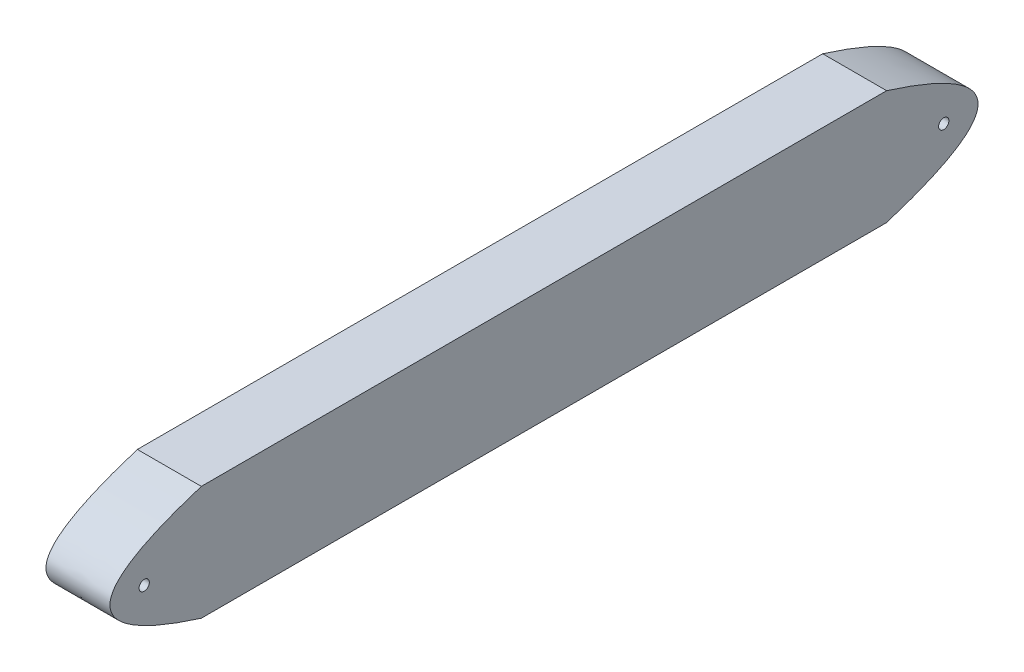
ISO-10303-21;
HEADER;
FILE_DESCRIPTION(('STEP AP214'),'2;1');
FILE_NAME('part.step','',(''),(''),'','','');
FILE_SCHEMA(('AUTOMOTIVE_DESIGN { 1 0 10303 214 1 1 1 1 }'));
ENDSEC;
DATA;
#1=APPLICATION_CONTEXT('core data for automotive mechanical design processes');
#2=APPLICATION_PROTOCOL_DEFINITION('international standard','automotive_design',2000,#1);
#3=PRODUCT_CONTEXT('',#1,'mechanical');
#4=PRODUCT('Part','Part','',(#3));
#5=PRODUCT_RELATED_PRODUCT_CATEGORY('part','',(#4));
#6=PRODUCT_DEFINITION_FORMATION('','',#4);
#7=PRODUCT_DEFINITION_CONTEXT('part definition',#1,'design');
#8=PRODUCT_DEFINITION('design','',#6,#7);
#9=PRODUCT_DEFINITION_SHAPE('','',#8);
#10=(LENGTH_UNIT() NAMED_UNIT(*) SI_UNIT(.MILLI.,.METRE.));
#11=(NAMED_UNIT(*) PLANE_ANGLE_UNIT() SI_UNIT($,.RADIAN.));
#12=(NAMED_UNIT(*) SI_UNIT($,.STERADIAN.) SOLID_ANGLE_UNIT());
#13=UNCERTAINTY_MEASURE_WITH_UNIT(LENGTH_MEASURE(1.E-05),#10,'distance_accuracy_value','');
#14=(GEOMETRIC_REPRESENTATION_CONTEXT(3) GLOBAL_UNCERTAINTY_ASSIGNED_CONTEXT((#13)) GLOBAL_UNIT_ASSIGNED_CONTEXT((#10,
#11,#12)) REPRESENTATION_CONTEXT('',''));
#15=CARTESIAN_POINT('',(0.,0.,0.));
#16=DIRECTION('',(0.,0.,1.));
#17=DIRECTION('',(1.,0.,0.));
#18=AXIS2_PLACEMENT_3D('',#15,#16,#17);
#19=CARTESIAN_POINT('',(28.,7.6811820792777E-11,190.));
#20=DIRECTION('',(-1.,0.,0.));
#21=DIRECTION('',(0.,0.,1.));
#22=AXIS2_PLACEMENT_3D('',#19,#20,#21);
#23=PLANE('',#22);
#24=CARTESIAN_POINT('',(28.,25.,150.));
#25=CARTESIAN_POINT('',(28.,1.53623641585554E-10,230.));
#26=CARTESIAN_POINT('',(28.,-25.,150.));
#27=B_SPLINE_CURVE_WITH_KNOTS('',2,(#24,#25,#26),.UNSPECIFIED.,.F.,.F.,(3,3),(0.,1.),.UNSPECIFIED.);
#28=CARTESIAN_POINT('',(28.,25.,150.));
#29=VERTEX_POINT('',#28);
#30=CARTESIAN_POINT('',(28.,-25.,150.));
#31=VERTEX_POINT('',#30);
#32=EDGE_CURVE('E86',#29,#31,#27,.T.);
#33=ORIENTED_EDGE('',*,*,#32,.T.);
#34=DIRECTION('',(0.,0.,-1.));
#35=VECTOR('',#34,1.);
#36=CARTESIAN_POINT('',(28.,-25.,150.));
#37=LINE('',#36,#35);
#38=CARTESIAN_POINT('',(28.,-25.,-150.));
#39=VERTEX_POINT('',#38);
#40=EDGE_CURVE('E81',#31,#39,#37,.T.);
#41=ORIENTED_EDGE('',*,*,#40,.T.);
#42=CARTESIAN_POINT('',(28.,-25.,-150.));
#43=CARTESIAN_POINT('',(28.,0.,-230.));
#44=CARTESIAN_POINT('',(28.,25.,-150.));
#45=B_SPLINE_CURVE_WITH_KNOTS('',2,(#42,#43,#44),.UNSPECIFIED.,.F.,.F.,(3,3),(0.,1.),.UNSPECIFIED.);
#46=CARTESIAN_POINT('',(28.,25.,-150.));
#47=VERTEX_POINT('',#46);
#48=EDGE_CURVE('E84',#39,#47,#45,.T.);
#49=ORIENTED_EDGE('',*,*,#48,.T.);
#50=DIRECTION('',(0.,0.,1.));
#51=VECTOR('',#50,1.);
#52=CARTESIAN_POINT('',(28.,25.,150.));
#53=LINE('',#52,#51);
#54=EDGE_CURVE('E51',#47,#29,#53,.T.);
#55=ORIENTED_EDGE('',*,*,#54,.T.);
#56=EDGE_LOOP('',(#33,#41,#49,#55));
#57=FACE_BOUND('',#56,.T.);
#58=CARTESIAN_POINT('',(28.,1.06810393862844E-10,175.));
#59=DIRECTION('',(1.,0.,0.));
#60=DIRECTION('',(0.,0.,-1.));
#61=AXIS2_PLACEMENT_3D('',#58,#59,#60);
#62=CIRCLE('',#61,2.25000000000001);
#63=CARTESIAN_POINT('',(28.,1.06810393862844E-10,172.75));
#64=VERTEX_POINT('',#63);
#65=EDGE_CURVE('E142',#64,#64,#62,.T.);
#66=ORIENTED_EDGE('',*,*,#65,.F.);
#67=EDGE_LOOP('',(#66));
#68=FACE_BOUND('',#67,.T.);
#69=CARTESIAN_POINT('',(28.,0.,-175.));
#70=DIRECTION('',(1.,0.,0.));
#71=DIRECTION('',(0.,0.,-1.));
#72=AXIS2_PLACEMENT_3D('',#69,#70,#71);
#73=CIRCLE('',#72,2.25000000000001);
#74=CARTESIAN_POINT('',(28.,0.,-177.25));
#75=VERTEX_POINT('',#74);
#76=EDGE_CURVE('E133',#75,#75,#73,.T.);
#77=ORIENTED_EDGE('',*,*,#76,.F.);
#78=EDGE_LOOP('',(#77));
#79=FACE_BOUND('',#78,.T.);
#80=ADVANCED_FACE('F33',(#57,#68,#79),#23,.F.);
#81=CARTESIAN_POINT('',(0.,7.6811820792777E-11,190.));
#82=DIRECTION('',(-1.,0.,0.));
#83=DIRECTION('',(0.,0.,1.));
#84=AXIS2_PLACEMENT_3D('',#81,#82,#83);
#85=PLANE('',#84);
#86=CARTESIAN_POINT('',(0.,1.06810393862844E-10,175.));
#87=DIRECTION('',(1.,0.,0.));
#88=DIRECTION('',(0.,0.,-1.));
#89=AXIS2_PLACEMENT_3D('',#86,#87,#88);
#90=CIRCLE('',#89,2.25000000000001);
#91=CARTESIAN_POINT('',(0.,1.06810393862844E-10,172.75));
#92=VERTEX_POINT('',#91);
#93=EDGE_CURVE('E139',#92,#92,#90,.T.);
#94=ORIENTED_EDGE('',*,*,#93,.T.);
#95=EDGE_LOOP('',(#94));
#96=FACE_BOUND('',#95,.T.);
#97=CARTESIAN_POINT('',(0.,25.,150.));
#98=CARTESIAN_POINT('',(0.,1.53623641585554E-10,230.));
#99=CARTESIAN_POINT('',(0.,-25.,150.));
#100=B_SPLINE_CURVE_WITH_KNOTS('',2,(#97,#98,#99),.UNSPECIFIED.,.F.,.F.,(3,3),(0.,1.),.UNSPECIFIED.);
#101=CARTESIAN_POINT('',(0.,25.,150.));
#102=VERTEX_POINT('',#101);
#103=CARTESIAN_POINT('',(0.,-25.,150.));
#104=VERTEX_POINT('',#103);
#105=EDGE_CURVE('E145',#102,#104,#100,.T.);
#106=ORIENTED_EDGE('',*,*,#105,.F.);
#107=DIRECTION('',(0.,0.,1.));
#108=VECTOR('',#107,1.);
#109=CARTESIAN_POINT('',(0.,25.,150.));
#110=LINE('',#109,#108);
#111=CARTESIAN_POINT('',(0.,25.,-150.));
#112=VERTEX_POINT('',#111);
#113=EDGE_CURVE('E74',#112,#102,#110,.T.);
#114=ORIENTED_EDGE('',*,*,#113,.F.);
#115=CARTESIAN_POINT('',(0.,-25.,-150.));
#116=CARTESIAN_POINT('',(0.,0.,-230.));
#117=CARTESIAN_POINT('',(0.,25.,-150.));
#118=B_SPLINE_CURVE_WITH_KNOTS('',2,(#115,#116,#117),.UNSPECIFIED.,.F.,.F.,(3,3),(0.,1.),.UNSPECIFIED.);
#119=CARTESIAN_POINT('',(0.,-25.,-150.));
#120=VERTEX_POINT('',#119);
#121=EDGE_CURVE('E68',#120,#112,#118,.T.);
#122=ORIENTED_EDGE('',*,*,#121,.F.);
#123=DIRECTION('',(0.,0.,-1.));
#124=VECTOR('',#123,1.);
#125=CARTESIAN_POINT('',(0.,-25.,150.));
#126=LINE('',#125,#124);
#127=EDGE_CURVE('E90',#104,#120,#126,.T.);
#128=ORIENTED_EDGE('',*,*,#127,.F.);
#129=EDGE_LOOP('',(#106,#114,#122,#128));
#130=FACE_BOUND('',#129,.T.);
#131=CARTESIAN_POINT('',(0.,0.,-175.));
#132=DIRECTION('',(1.,0.,0.));
#133=DIRECTION('',(0.,0.,-1.));
#134=AXIS2_PLACEMENT_3D('',#131,#132,#133);
#135=CIRCLE('',#134,2.25000000000001);
#136=CARTESIAN_POINT('',(0.,0.,-177.25));
#137=VERTEX_POINT('',#136);
#138=EDGE_CURVE('E136',#137,#137,#135,.T.);
#139=ORIENTED_EDGE('',*,*,#138,.T.);
#140=EDGE_LOOP('',(#139));
#141=FACE_BOUND('',#140,.T.);
#142=ADVANCED_FACE('F112',(#96,#130,#141),#85,.T.);
#143=DIRECTION('',(-1.,0.,0.));
#144=VECTOR('',#143,1.);
#145=SURFACE_OF_LINEAR_EXTRUSION('',#27,#144);
#146=ORIENTED_EDGE('',*,*,#105,.T.);
#147=DIRECTION('',(-1.,0.,0.));
#148=VECTOR('',#147,1.);
#149=CARTESIAN_POINT('',(28.,-25.,150.));
#150=LINE('',#149,#148);
#151=EDGE_CURVE('E11',#31,#104,#150,.T.);
#152=ORIENTED_EDGE('',*,*,#151,.F.);
#153=ORIENTED_EDGE('',*,*,#32,.F.);
#154=DIRECTION('',(-1.,0.,0.));
#155=VECTOR('',#154,1.);
#156=CARTESIAN_POINT('',(28.,25.,150.));
#157=LINE('',#156,#155);
#158=EDGE_CURVE('E94',#29,#102,#157,.T.);
#159=ORIENTED_EDGE('',*,*,#158,.T.);
#160=EDGE_LOOP('',(#146,#152,#153,#159));
#161=FACE_BOUND('',#160,.T.);
#162=ADVANCED_FACE('F35',(#161),#145,.F.);
#163=CARTESIAN_POINT('',(28.,-25.,150.));
#164=DIRECTION('',(0.,1.,0.));
#165=DIRECTION('',(0.,0.,1.));
#166=AXIS2_PLACEMENT_3D('',#163,#164,#165);
#167=PLANE('',#166);
#168=ORIENTED_EDGE('',*,*,#127,.T.);
#169=DIRECTION('',(-1.,0.,0.));
#170=VECTOR('',#169,1.);
#171=CARTESIAN_POINT('',(28.,-25.,-150.));
#172=LINE('',#171,#170);
#173=EDGE_CURVE('E43',#39,#120,#172,.T.);
#174=ORIENTED_EDGE('',*,*,#173,.F.);
#175=ORIENTED_EDGE('',*,*,#40,.F.);
#176=ORIENTED_EDGE('',*,*,#151,.T.);
#177=EDGE_LOOP('',(#168,#174,#175,#176));
#178=FACE_BOUND('',#177,.T.);
#179=ADVANCED_FACE('F89',(#178),#167,.F.);
#180=DIRECTION('',(-1.,0.,0.));
#181=VECTOR('',#180,1.);
#182=SURFACE_OF_LINEAR_EXTRUSION('',#45,#181);
#183=ORIENTED_EDGE('',*,*,#121,.T.);
#184=DIRECTION('',(-1.,0.,0.));
#185=VECTOR('',#184,1.);
#186=CARTESIAN_POINT('',(28.,25.,-150.));
#187=LINE('',#186,#185);
#188=EDGE_CURVE('E91',#47,#112,#187,.T.);
#189=ORIENTED_EDGE('',*,*,#188,.F.);
#190=ORIENTED_EDGE('',*,*,#48,.F.);
#191=ORIENTED_EDGE('',*,*,#173,.T.);
#192=EDGE_LOOP('',(#183,#189,#190,#191));
#193=FACE_BOUND('',#192,.T.);
#194=ADVANCED_FACE('F92',(#193),#182,.F.);
#195=CARTESIAN_POINT('',(28.,25.,150.));
#196=DIRECTION('',(0.,-1.,0.));
#197=DIRECTION('',(0.,0.,-1.));
#198=AXIS2_PLACEMENT_3D('',#195,#196,#197);
#199=PLANE('',#198);
#200=ORIENTED_EDGE('',*,*,#113,.T.);
#201=ORIENTED_EDGE('',*,*,#158,.F.);
#202=ORIENTED_EDGE('',*,*,#54,.F.);
#203=ORIENTED_EDGE('',*,*,#188,.T.);
#204=EDGE_LOOP('',(#200,#201,#202,#203));
#205=FACE_BOUND('',#204,.T.);
#206=ADVANCED_FACE('F106',(#205),#199,.F.);
#207=CARTESIAN_POINT('',(28.,1.06810393862844E-10,175.));
#208=DIRECTION('',(-1.,0.,0.));
#209=DIRECTION('',(0.,0.,1.));
#210=AXIS2_PLACEMENT_3D('',#207,#208,#209);
#211=CYLINDRICAL_SURFACE('',#210,2.25000000000001);
#212=ORIENTED_EDGE('',*,*,#65,.T.);
#213=EDGE_LOOP('',(#212));
#214=FACE_BOUND('',#213,.T.);
#215=ORIENTED_EDGE('',*,*,#93,.F.);
#216=EDGE_LOOP('',(#215));
#217=FACE_BOUND('',#216,.T.);
#218=ADVANCED_FACE('F121',(#214,#217),#211,.F.);
#219=CARTESIAN_POINT('',(28.,0.,-175.));
#220=DIRECTION('',(-1.,0.,0.));
#221=DIRECTION('',(0.,0.,1.));
#222=AXIS2_PLACEMENT_3D('',#219,#220,#221);
#223=CYLINDRICAL_SURFACE('',#222,2.25000000000001);
#224=ORIENTED_EDGE('',*,*,#76,.T.);
#225=EDGE_LOOP('',(#224));
#226=FACE_BOUND('',#225,.T.);
#227=ORIENTED_EDGE('',*,*,#138,.F.);
#228=EDGE_LOOP('',(#227));
#229=FACE_BOUND('',#228,.T.);
#230=ADVANCED_FACE('F124',(#226,#229),#223,.F.);
#231=CLOSED_SHELL('',(#80,#142,#162,#179,#194,#206,#218,#230));
#232=MANIFOLD_SOLID_BREP('B2',#231);
#233=ADVANCED_BREP_SHAPE_REPRESENTATION('',(#18,#232),#14);
#234=SHAPE_DEFINITION_REPRESENTATION(#9,#233);
ENDSEC;
END-ISO-10303-21;
